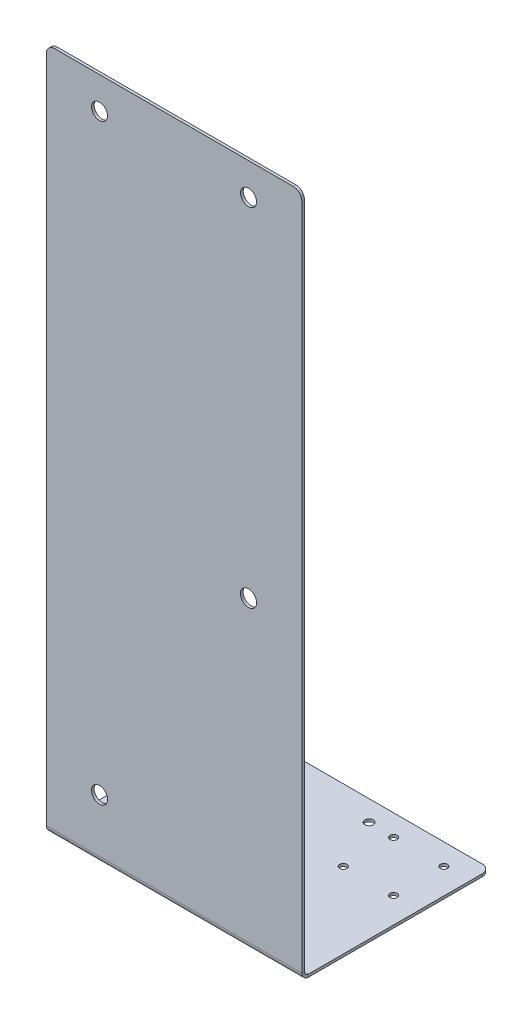
ISO-10303-21;
HEADER;
FILE_DESCRIPTION(('STEP AP214'),'2;1');
FILE_NAME('part.step','',(''),(''),'','','');
FILE_SCHEMA(('AUTOMOTIVE_DESIGN { 1 0 10303 214 1 1 1 1 }'));
ENDSEC;
DATA;
#1=APPLICATION_CONTEXT('core data for automotive mechanical design processes');
#2=APPLICATION_PROTOCOL_DEFINITION('international standard','automotive_design',2000,#1);
#3=PRODUCT_CONTEXT('',#1,'mechanical');
#4=PRODUCT('Part','Part','',(#3));
#5=PRODUCT_RELATED_PRODUCT_CATEGORY('part','',(#4));
#6=PRODUCT_DEFINITION_FORMATION('','',#4);
#7=PRODUCT_DEFINITION_CONTEXT('part definition',#1,'design');
#8=PRODUCT_DEFINITION('design','',#6,#7);
#9=PRODUCT_DEFINITION_SHAPE('','',#8);
#10=(LENGTH_UNIT() NAMED_UNIT(*) SI_UNIT(.MILLI.,.METRE.));
#11=(NAMED_UNIT(*) PLANE_ANGLE_UNIT() SI_UNIT($,.RADIAN.));
#12=(NAMED_UNIT(*) SI_UNIT($,.STERADIAN.) SOLID_ANGLE_UNIT());
#13=UNCERTAINTY_MEASURE_WITH_UNIT(LENGTH_MEASURE(1.E-05),#10,'distance_accuracy_value','');
#14=(GEOMETRIC_REPRESENTATION_CONTEXT(3) GLOBAL_UNCERTAINTY_ASSIGNED_CONTEXT((#13)) GLOBAL_UNIT_ASSIGNED_CONTEXT((#10,
#11,#12)) REPRESENTATION_CONTEXT('',''));
#15=CARTESIAN_POINT('',(0.,0.,0.));
#16=DIRECTION('',(0.,0.,1.));
#17=DIRECTION('',(1.,0.,0.));
#18=AXIS2_PLACEMENT_3D('',#15,#16,#17);
#19=CARTESIAN_POINT('',(71.12,3.175,-52.07));
#20=DIRECTION('',(0.,1.,0.));
#21=DIRECTION('',(0.,0.,1.));
#22=AXIS2_PLACEMENT_3D('',#19,#20,#21);
#23=CYLINDRICAL_SURFACE('',#22,5.08);
#24=DIRECTION('',(0.,1.,0.));
#25=VECTOR('',#24,1.);
#26=CARTESIAN_POINT('',(76.2,3.175,-52.07));
#27=LINE('',#26,#25);
#28=CARTESIAN_POINT('',(76.2,1.5875,-52.07));
#29=VERTEX_POINT('',#28);
#30=CARTESIAN_POINT('',(76.2,3.175,-52.07));
#31=VERTEX_POINT('',#30);
#32=EDGE_CURVE('E11',#29,#31,#27,.T.);
#33=ORIENTED_EDGE('',*,*,#32,.F.);
#34=CARTESIAN_POINT('',(71.12,1.5875,-52.07));
#35=DIRECTION('',(0.,1.,0.));
#36=DIRECTION('',(0.,0.,1.));
#37=AXIS2_PLACEMENT_3D('',#34,#35,#36);
#38=CIRCLE('',#37,5.08);
#39=CARTESIAN_POINT('',(71.12,1.5875,-57.15));
#40=VERTEX_POINT('',#39);
#41=EDGE_CURVE('E134',#29,#40,#38,.T.);
#42=ORIENTED_EDGE('',*,*,#41,.T.);
#43=DIRECTION('',(0.,1.,0.));
#44=VECTOR('',#43,1.);
#45=CARTESIAN_POINT('',(71.12,3.175,-57.15));
#46=LINE('',#45,#44);
#47=CARTESIAN_POINT('',(71.12,3.175,-57.15));
#48=VERTEX_POINT('',#47);
#49=EDGE_CURVE('E48',#40,#48,#46,.T.);
#50=ORIENTED_EDGE('',*,*,#49,.T.);
#51=CARTESIAN_POINT('',(71.12,3.175,-52.07));
#52=DIRECTION('',(0.,1.,0.));
#53=DIRECTION('',(0.,0.,1.));
#54=AXIS2_PLACEMENT_3D('',#51,#52,#53);
#55=CIRCLE('',#54,5.08);
#56=EDGE_CURVE('E221',#31,#48,#55,.T.);
#57=ORIENTED_EDGE('',*,*,#56,.F.);
#58=EDGE_LOOP('',(#33,#42,#50,#57));
#59=FACE_BOUND('',#58,.T.);
#60=ADVANCED_FACE('F38',(#59),#23,.T.);
#61=CARTESIAN_POINT('',(76.2,3.175,-57.15));
#62=DIRECTION('',(0.,0.,-1.));
#63=DIRECTION('',(-1.,0.,0.));
#64=AXIS2_PLACEMENT_3D('',#61,#62,#63);
#65=PLANE('',#64);
#66=ORIENTED_EDGE('',*,*,#49,.F.);
#67=DIRECTION('',(1.,0.,0.));
#68=VECTOR('',#67,1.);
#69=CARTESIAN_POINT('',(0.,1.5875,-57.15));
#70=LINE('',#69,#68);
#71=CARTESIAN_POINT('',(-71.12,1.5875,-57.15));
#72=VERTEX_POINT('',#71);
#73=EDGE_CURVE('E162',#40,#72,#70,.F.);
#74=ORIENTED_EDGE('',*,*,#73,.T.);
#75=DIRECTION('',(0.,1.,0.));
#76=VECTOR('',#75,1.);
#77=CARTESIAN_POINT('',(-71.12,3.175,-57.15));
#78=LINE('',#77,#76);
#79=CARTESIAN_POINT('',(-71.12,3.175,-57.15));
#80=VERTEX_POINT('',#79);
#81=EDGE_CURVE('E214',#72,#80,#78,.T.);
#82=ORIENTED_EDGE('',*,*,#81,.T.);
#83=DIRECTION('',(-1.,0.,0.));
#84=VECTOR('',#83,1.);
#85=CARTESIAN_POINT('',(76.2,3.175,-57.15));
#86=LINE('',#85,#84);
#87=EDGE_CURVE('E230',#48,#80,#86,.T.);
#88=ORIENTED_EDGE('',*,*,#87,.F.);
#89=EDGE_LOOP('',(#66,#74,#82,#88));
#90=FACE_BOUND('',#89,.T.);
#91=ADVANCED_FACE('F234',(#90),#65,.T.);
#92=CARTESIAN_POINT('',(-71.12,3.175,-52.07));
#93=DIRECTION('',(0.,1.,0.));
#94=DIRECTION('',(0.,0.,1.));
#95=AXIS2_PLACEMENT_3D('',#92,#93,#94);
#96=CYLINDRICAL_SURFACE('',#95,5.08);
#97=ORIENTED_EDGE('',*,*,#81,.F.);
#98=CARTESIAN_POINT('',(-71.12,1.5875,-52.07));
#99=DIRECTION('',(0.,1.,0.));
#100=DIRECTION('',(0.,0.,1.));
#101=AXIS2_PLACEMENT_3D('',#98,#99,#100);
#102=CIRCLE('',#101,5.08);
#103=CARTESIAN_POINT('',(-76.2,1.5875,-52.07));
#104=VERTEX_POINT('',#103);
#105=EDGE_CURVE('E159',#72,#104,#102,.T.);
#106=ORIENTED_EDGE('',*,*,#105,.T.);
#107=DIRECTION('',(0.,1.,0.));
#108=VECTOR('',#107,1.);
#109=CARTESIAN_POINT('',(-76.2,3.175,-52.07));
#110=LINE('',#109,#108);
#111=CARTESIAN_POINT('',(-76.2,3.175,-52.07));
#112=VERTEX_POINT('',#111);
#113=EDGE_CURVE('E211',#104,#112,#110,.T.);
#114=ORIENTED_EDGE('',*,*,#113,.T.);
#115=CARTESIAN_POINT('',(-71.12,3.175,-52.07));
#116=DIRECTION('',(0.,1.,0.));
#117=DIRECTION('',(0.,0.,1.));
#118=AXIS2_PLACEMENT_3D('',#115,#116,#117);
#119=CIRCLE('',#118,5.08);
#120=EDGE_CURVE('E235',#80,#112,#119,.T.);
#121=ORIENTED_EDGE('',*,*,#120,.F.);
#122=EDGE_LOOP('',(#97,#106,#114,#121));
#123=FACE_BOUND('',#122,.T.);
#124=ADVANCED_FACE('F323',(#123),#96,.T.);
#125=CARTESIAN_POINT('',(-76.2,3.175,57.15));
#126=DIRECTION('',(-1.,0.,0.));
#127=DIRECTION('',(0.,0.,1.));
#128=AXIS2_PLACEMENT_3D('',#125,#126,#127);
#129=PLANE('',#128);
#130=ORIENTED_EDGE('',*,*,#113,.F.);
#131=DIRECTION('',(0.,0.,1.));
#132=VECTOR('',#131,1.);
#133=CARTESIAN_POINT('',(-76.2,1.5875,0.));
#134=LINE('',#133,#132);
#135=CARTESIAN_POINT('',(-76.2,1.5875,51.435));
#136=VERTEX_POINT('',#135);
#137=EDGE_CURVE('E130',#104,#136,#134,.T.);
#138=ORIENTED_EDGE('',*,*,#137,.T.);
#139=DIRECTION('',(0.,1.,0.));
#140=VECTOR('',#139,1.);
#141=CARTESIAN_POINT('',(-76.2,3.175,51.435));
#142=LINE('',#141,#140);
#143=CARTESIAN_POINT('',(-76.2,3.175,51.435));
#144=VERTEX_POINT('',#143);
#145=EDGE_CURVE('E208',#136,#144,#142,.T.);
#146=ORIENTED_EDGE('',*,*,#145,.T.);
#147=DIRECTION('',(0.,0.,1.));
#148=VECTOR('',#147,1.);
#149=CARTESIAN_POINT('',(-76.2,3.175,57.15));
#150=LINE('',#149,#148);
#151=EDGE_CURVE('E238',#112,#144,#150,.T.);
#152=ORIENTED_EDGE('',*,*,#151,.F.);
#153=EDGE_LOOP('',(#130,#138,#146,#152));
#154=FACE_BOUND('',#153,.T.);
#155=ADVANCED_FACE('F599',(#154),#129,.T.);
#156=CARTESIAN_POINT('',(-76.2,5.71500000000003,51.435));
#157=DIRECTION('',(-1.,0.,0.));
#158=DIRECTION('',(0.,0.,1.));
#159=AXIS2_PLACEMENT_3D('',#156,#157,#158);
#160=PLANE('',#159);
#161=ORIENTED_EDGE('',*,*,#145,.F.);
#162=CARTESIAN_POINT('',(-76.2,5.71500000000003,51.435));
#163=DIRECTION('',(-1.,0.,0.));
#164=DIRECTION('',(0.,0.,1.));
#165=AXIS2_PLACEMENT_3D('',#162,#163,#164);
#166=CIRCLE('',#165,4.1275);
#167=CARTESIAN_POINT('',(-76.2,5.71500000000003,55.5625));
#168=VERTEX_POINT('',#167);
#169=EDGE_CURVE('E126',#168,#136,#166,.F.);
#170=ORIENTED_EDGE('',*,*,#169,.F.);
#171=DIRECTION('',(0.,0.,-1.));
#172=VECTOR('',#171,1.);
#173=CARTESIAN_POINT('',(-76.2,5.71500000000003,53.975));
#174=LINE('',#173,#172);
#175=CARTESIAN_POINT('',(-76.2,5.71500000000003,53.975));
#176=VERTEX_POINT('',#175);
#177=EDGE_CURVE('E56',#168,#176,#174,.T.);
#178=ORIENTED_EDGE('',*,*,#177,.T.);
#179=CARTESIAN_POINT('',(-76.2,5.71500000000003,51.435));
#180=DIRECTION('',(1.,0.,0.));
#181=DIRECTION('',(0.,0.,-1.));
#182=AXIS2_PLACEMENT_3D('',#179,#180,#181);
#183=CIRCLE('',#182,2.54);
#184=EDGE_CURVE('E116',#176,#144,#183,.T.);
#185=ORIENTED_EDGE('',*,*,#184,.T.);
#186=EDGE_LOOP('',(#161,#170,#178,#185));
#187=FACE_BOUND('',#186,.T.);
#188=ADVANCED_FACE('F271',(#187),#160,.T.);
#189=CARTESIAN_POINT('',(-76.2,409.575,53.975));
#190=DIRECTION('',(-1.,0.,0.));
#191=DIRECTION('',(0.,-1.,0.));
#192=AXIS2_PLACEMENT_3D('',#189,#190,#191);
#193=PLANE('',#192);
#194=ORIENTED_EDGE('',*,*,#177,.F.);
#195=DIRECTION('',(0.,1.,0.));
#196=VECTOR('',#195,1.);
#197=CARTESIAN_POINT('',(-76.2,409.575,55.5625));
#198=LINE('',#197,#196);
#199=CARTESIAN_POINT('',(-76.2,404.495,55.5625));
#200=VERTEX_POINT('',#199);
#201=EDGE_CURVE('E155',#200,#168,#198,.F.);
#202=ORIENTED_EDGE('',*,*,#201,.F.);
#203=DIRECTION('',(0.,0.,-1.));
#204=VECTOR('',#203,1.);
#205=CARTESIAN_POINT('',(-76.2,404.495,53.975));
#206=LINE('',#205,#204);
#207=CARTESIAN_POINT('',(-76.2,404.495,53.975));
#208=VERTEX_POINT('',#207);
#209=EDGE_CURVE('E204',#200,#208,#206,.T.);
#210=ORIENTED_EDGE('',*,*,#209,.T.);
#211=DIRECTION('',(0.,-1.,0.));
#212=VECTOR('',#211,1.);
#213=CARTESIAN_POINT('',(-76.2,409.575,53.975));
#214=LINE('',#213,#212);
#215=EDGE_CURVE('E232',#208,#176,#214,.T.);
#216=ORIENTED_EDGE('',*,*,#215,.T.);
#217=EDGE_LOOP('',(#194,#202,#210,#216));
#218=FACE_BOUND('',#217,.T.);
#219=ADVANCED_FACE('F304',(#218),#193,.T.);
#220=CARTESIAN_POINT('',(-71.12,404.495,53.975));
#221=DIRECTION('',(0.,0.,1.));
#222=DIRECTION('',(1.,0.,0.));
#223=AXIS2_PLACEMENT_3D('',#220,#221,#222);
#224=CYLINDRICAL_SURFACE('',#223,5.08);
#225=ORIENTED_EDGE('',*,*,#209,.F.);
#226=CARTESIAN_POINT('',(-71.12,404.495,55.5625));
#227=DIRECTION('',(0.,0.,1.));
#228=DIRECTION('',(1.,0.,0.));
#229=AXIS2_PLACEMENT_3D('',#226,#227,#228);
#230=CIRCLE('',#229,5.08);
#231=CARTESIAN_POINT('',(-71.12,409.575,55.5625));
#232=VERTEX_POINT('',#231);
#233=EDGE_CURVE('E152',#200,#232,#230,.F.);
#234=ORIENTED_EDGE('',*,*,#233,.T.);
#235=DIRECTION('',(0.,0.,-1.));
#236=VECTOR('',#235,1.);
#237=CARTESIAN_POINT('',(-71.12,409.575,53.975));
#238=LINE('',#237,#236);
#239=CARTESIAN_POINT('',(-71.12,409.575,53.975));
#240=VERTEX_POINT('',#239);
#241=EDGE_CURVE('E201',#232,#240,#238,.T.);
#242=ORIENTED_EDGE('',*,*,#241,.T.);
#243=CARTESIAN_POINT('',(-71.12,404.495,53.975));
#244=DIRECTION('',(0.,0.,1.));
#245=DIRECTION('',(1.,0.,0.));
#246=AXIS2_PLACEMENT_3D('',#243,#244,#245);
#247=CIRCLE('',#246,5.08);
#248=EDGE_CURVE('E251',#208,#240,#247,.F.);
#249=ORIENTED_EDGE('',*,*,#248,.F.);
#250=EDGE_LOOP('',(#225,#234,#242,#249));
#251=FACE_BOUND('',#250,.T.);
#252=ADVANCED_FACE('F307',(#251),#224,.T.);
#253=CARTESIAN_POINT('',(-76.2,409.575,53.975));
#254=DIRECTION('',(0.,1.,0.));
#255=DIRECTION('',(-1.,0.,0.));
#256=AXIS2_PLACEMENT_3D('',#253,#254,#255);
#257=PLANE('',#256);
#258=ORIENTED_EDGE('',*,*,#241,.F.);
#259=DIRECTION('',(1.,0.,0.));
#260=VECTOR('',#259,1.);
#261=CARTESIAN_POINT('',(-76.2,409.575,55.5625));
#262=LINE('',#261,#260);
#263=CARTESIAN_POINT('',(71.1199999999999,409.575,55.5625));
#264=VERTEX_POINT('',#263);
#265=EDGE_CURVE('E149',#264,#232,#262,.F.);
#266=ORIENTED_EDGE('',*,*,#265,.F.);
#267=DIRECTION('',(0.,0.,-1.));
#268=VECTOR('',#267,1.);
#269=CARTESIAN_POINT('',(71.1199999999999,409.575,53.975));
#270=LINE('',#269,#268);
#271=CARTESIAN_POINT('',(71.1199999999999,409.575,53.975));
#272=VERTEX_POINT('',#271);
#273=EDGE_CURVE('E198',#264,#272,#270,.T.);
#274=ORIENTED_EDGE('',*,*,#273,.T.);
#275=DIRECTION('',(-1.,0.,0.));
#276=VECTOR('',#275,1.);
#277=CARTESIAN_POINT('',(-76.2,409.575,53.975));
#278=LINE('',#277,#276);
#279=EDGE_CURVE('E254',#272,#240,#278,.T.);
#280=ORIENTED_EDGE('',*,*,#279,.T.);
#281=EDGE_LOOP('',(#258,#266,#274,#280));
#282=FACE_BOUND('',#281,.T.);
#283=ADVANCED_FACE('F309',(#282),#257,.T.);
#284=CARTESIAN_POINT('',(71.12,404.495,53.975));
#285=DIRECTION('',(0.,0.,1.));
#286=DIRECTION('',(1.,0.,0.));
#287=AXIS2_PLACEMENT_3D('',#284,#285,#286);
#288=CYLINDRICAL_SURFACE('',#287,5.08);
#289=ORIENTED_EDGE('',*,*,#273,.F.);
#290=CARTESIAN_POINT('',(71.12,404.495,55.5625));
#291=DIRECTION('',(0.,0.,1.));
#292=DIRECTION('',(1.,0.,0.));
#293=AXIS2_PLACEMENT_3D('',#290,#291,#292);
#294=CIRCLE('',#293,5.08);
#295=CARTESIAN_POINT('',(76.2,404.495,55.5625));
#296=VERTEX_POINT('',#295);
#297=EDGE_CURVE('E146',#264,#296,#294,.F.);
#298=ORIENTED_EDGE('',*,*,#297,.T.);
#299=DIRECTION('',(0.,0.,-1.));
#300=VECTOR('',#299,1.);
#301=CARTESIAN_POINT('',(76.2,404.495,53.975));
#302=LINE('',#301,#300);
#303=CARTESIAN_POINT('',(76.2,404.495,53.975));
#304=VERTEX_POINT('',#303);
#305=EDGE_CURVE('E195',#296,#304,#302,.T.);
#306=ORIENTED_EDGE('',*,*,#305,.T.);
#307=CARTESIAN_POINT('',(71.12,404.495,53.975));
#308=DIRECTION('',(0.,0.,1.));
#309=DIRECTION('',(1.,0.,0.));
#310=AXIS2_PLACEMENT_3D('',#307,#308,#309);
#311=CIRCLE('',#310,5.08);
#312=EDGE_CURVE('E257',#272,#304,#311,.F.);
#313=ORIENTED_EDGE('',*,*,#312,.F.);
#314=EDGE_LOOP('',(#289,#298,#306,#313));
#315=FACE_BOUND('',#314,.T.);
#316=ADVANCED_FACE('F288',(#315),#288,.T.);
#317=CARTESIAN_POINT('',(76.2,409.575,53.975));
#318=DIRECTION('',(-1.,0.,0.));
#319=DIRECTION('',(0.,-1.,0.));
#320=AXIS2_PLACEMENT_3D('',#317,#318,#319);
#321=PLANE('',#320);
#322=ORIENTED_EDGE('',*,*,#305,.F.);
#323=DIRECTION('',(0.,1.,0.));
#324=VECTOR('',#323,1.);
#325=CARTESIAN_POINT('',(76.2,409.575,55.5625));
#326=LINE('',#325,#324);
#327=CARTESIAN_POINT('',(76.2,5.71500000000003,55.5625));
#328=VERTEX_POINT('',#327);
#329=EDGE_CURVE('E142',#296,#328,#326,.F.);
#330=ORIENTED_EDGE('',*,*,#329,.T.);
#331=DIRECTION('',(0.,0.,-1.));
#332=VECTOR('',#331,1.);
#333=CARTESIAN_POINT('',(76.2,5.71500000000003,53.975));
#334=LINE('',#333,#332);
#335=CARTESIAN_POINT('',(76.2,5.71500000000003,53.975));
#336=VERTEX_POINT('',#335);
#337=EDGE_CURVE('E115',#328,#336,#334,.T.);
#338=ORIENTED_EDGE('',*,*,#337,.T.);
#339=DIRECTION('',(0.,-1.,0.));
#340=VECTOR('',#339,1.);
#341=CARTESIAN_POINT('',(76.2,409.575,53.975));
#342=LINE('',#341,#340);
#343=EDGE_CURVE('E260',#304,#336,#342,.T.);
#344=ORIENTED_EDGE('',*,*,#343,.F.);
#345=EDGE_LOOP('',(#322,#330,#338,#344));
#346=FACE_BOUND('',#345,.T.);
#347=ADVANCED_FACE('F297',(#346),#321,.F.);
#348=CARTESIAN_POINT('',(76.2,5.71500000000003,51.435));
#349=DIRECTION('',(1.,0.,0.));
#350=DIRECTION('',(0.,0.,-1.));
#351=AXIS2_PLACEMENT_3D('',#348,#349,#350);
#352=PLANE('',#351);
#353=ORIENTED_EDGE('',*,*,#337,.F.);
#354=CARTESIAN_POINT('',(76.2,5.71500000000003,51.435));
#355=DIRECTION('',(-1.,0.,0.));
#356=DIRECTION('',(0.,0.,1.));
#357=AXIS2_PLACEMENT_3D('',#354,#355,#356);
#358=CIRCLE('',#357,4.1275);
#359=CARTESIAN_POINT('',(76.2,1.5875,51.435));
#360=VERTEX_POINT('',#359);
#361=EDGE_CURVE('E124',#360,#328,#358,.T.);
#362=ORIENTED_EDGE('',*,*,#361,.F.);
#363=DIRECTION('',(0.,1.,0.));
#364=VECTOR('',#363,1.);
#365=CARTESIAN_POINT('',(76.2,3.175,51.435));
#366=LINE('',#365,#364);
#367=CARTESIAN_POINT('',(76.2,3.175,51.435));
#368=VERTEX_POINT('',#367);
#369=EDGE_CURVE('E42',#360,#368,#366,.T.);
#370=ORIENTED_EDGE('',*,*,#369,.T.);
#371=CARTESIAN_POINT('',(76.2,5.71500000000003,51.435));
#372=DIRECTION('',(-1.,0.,0.));
#373=DIRECTION('',(0.,0.,1.));
#374=AXIS2_PLACEMENT_3D('',#371,#372,#373);
#375=CIRCLE('',#374,2.54);
#376=EDGE_CURVE('E266',#368,#336,#375,.T.);
#377=ORIENTED_EDGE('',*,*,#376,.T.);
#378=EDGE_LOOP('',(#353,#362,#370,#377));
#379=FACE_BOUND('',#378,.T.);
#380=ADVANCED_FACE('F136',(#379),#352,.T.);
#381=CARTESIAN_POINT('',(30.9880000000026,3.17500000000537,-44.45));
#382=DIRECTION('',(0.,1.,0.));
#383=DIRECTION('',(0.,0.,1.));
#384=AXIS2_PLACEMENT_3D('',#381,#382,#383);
#385=CYLINDRICAL_SURFACE('',#384,2.159);
#386=CARTESIAN_POINT('',(30.9880000000026,3.17500000000537,-44.45));
#387=DIRECTION('',(0.,1.,0.));
#388=DIRECTION('',(0.,0.,1.));
#389=AXIS2_PLACEMENT_3D('',#386,#387,#388);
#390=CIRCLE('',#389,2.159);
#391=CARTESIAN_POINT('',(30.9880000000026,3.17500000000537,-42.291));
#392=VERTEX_POINT('',#391);
#393=EDGE_CURVE('E140',#392,#392,#390,.T.);
#394=ORIENTED_EDGE('',*,*,#393,.T.);
#395=EDGE_LOOP('',(#394));
#396=FACE_BOUND('',#395,.T.);
#397=CARTESIAN_POINT('',(30.9880000000026,1.58750000000537,-44.45));
#398=DIRECTION('',(0.,1.,0.));
#399=DIRECTION('',(0.,0.,1.));
#400=AXIS2_PLACEMENT_3D('',#397,#398,#399);
#401=CIRCLE('',#400,2.159);
#402=CARTESIAN_POINT('',(30.9880000000026,1.58750000000537,-42.291));
#403=VERTEX_POINT('',#402);
#404=EDGE_CURVE('E167',#403,#403,#401,.T.);
#405=ORIENTED_EDGE('',*,*,#404,.F.);
#406=EDGE_LOOP('',(#405));
#407=FACE_BOUND('',#406,.T.);
#408=ADVANCED_FACE('F329',(#396,#407),#385,.F.);
#409=CARTESIAN_POINT('',(15.8749999999996,3.17500000000137,37.465));
#410=DIRECTION('',(0.,1.,0.));
#411=DIRECTION('',(0.,0.,1.));
#412=AXIS2_PLACEMENT_3D('',#409,#410,#411);
#413=CYLINDRICAL_SURFACE('',#412,2.54);
#414=CARTESIAN_POINT('',(15.8749999999996,3.17500000000137,37.465));
#415=DIRECTION('',(0.,1.,0.));
#416=DIRECTION('',(0.,0.,1.));
#417=AXIS2_PLACEMENT_3D('',#414,#415,#416);
#418=CIRCLE('',#417,2.54);
#419=CARTESIAN_POINT('',(15.8749999999996,3.17500000000137,40.005));
#420=VERTEX_POINT('',#419);
#421=EDGE_CURVE('E672',#420,#420,#418,.T.);
#422=ORIENTED_EDGE('',*,*,#421,.T.);
#423=EDGE_LOOP('',(#422));
#424=FACE_BOUND('',#423,.T.);
#425=CARTESIAN_POINT('',(15.8749999999996,1.58750000000137,37.465));
#426=DIRECTION('',(0.,1.,0.));
#427=DIRECTION('',(0.,0.,1.));
#428=AXIS2_PLACEMENT_3D('',#425,#426,#427);
#429=CIRCLE('',#428,2.54);
#430=CARTESIAN_POINT('',(15.8749999999996,1.58750000000137,40.005));
#431=VERTEX_POINT('',#430);
#432=EDGE_CURVE('E170',#431,#431,#429,.T.);
#433=ORIENTED_EDGE('',*,*,#432,.F.);
#434=EDGE_LOOP('',(#433));
#435=FACE_BOUND('',#434,.T.);
#436=ADVANCED_FACE('F332',(#424,#435),#413,.F.);
#437=CARTESIAN_POINT('',(-66.6750000000018,3.17500000000914,37.465));
#438=DIRECTION('',(0.,1.,0.));
#439=DIRECTION('',(0.,0.,1.));
#440=AXIS2_PLACEMENT_3D('',#437,#438,#439);
#441=CYLINDRICAL_SURFACE('',#440,2.54000000000001);
#442=CARTESIAN_POINT('',(-66.6750000000018,3.17500000000914,37.465));
#443=DIRECTION('',(0.,1.,0.));
#444=DIRECTION('',(0.,0.,1.));
#445=AXIS2_PLACEMENT_3D('',#442,#443,#444);
#446=CIRCLE('',#445,2.54000000000001);
#447=CARTESIAN_POINT('',(-66.6750000000018,3.17500000000914,40.005));
#448=VERTEX_POINT('',#447);
#449=EDGE_CURVE('E676',#448,#448,#446,.T.);
#450=ORIENTED_EDGE('',*,*,#449,.T.);
#451=EDGE_LOOP('',(#450));
#452=FACE_BOUND('',#451,.T.);
#453=CARTESIAN_POINT('',(-66.6750000000018,1.58750000000914,37.465));
#454=DIRECTION('',(0.,1.,0.));
#455=DIRECTION('',(0.,0.,1.));
#456=AXIS2_PLACEMENT_3D('',#453,#454,#455);
#457=CIRCLE('',#456,2.54000000000001);
#458=CARTESIAN_POINT('',(-66.6750000000018,1.58750000000914,40.005));
#459=VERTEX_POINT('',#458);
#460=EDGE_CURVE('E174',#459,#459,#457,.T.);
#461=ORIENTED_EDGE('',*,*,#460,.F.);
#462=EDGE_LOOP('',(#461));
#463=FACE_BOUND('',#462,.T.);
#464=ADVANCED_FACE('F336',(#452,#463),#441,.F.);
#465=CARTESIAN_POINT('',(15.8749999999995,3.17500000000387,-44.958));
#466=DIRECTION('',(0.,1.,0.));
#467=DIRECTION('',(0.,0.,1.));
#468=AXIS2_PLACEMENT_3D('',#465,#466,#467);
#469=CYLINDRICAL_SURFACE('',#468,2.54);
#470=CARTESIAN_POINT('',(15.8749999999995,3.17500000000387,-44.958));
#471=DIRECTION('',(0.,1.,0.));
#472=DIRECTION('',(0.,0.,1.));
#473=AXIS2_PLACEMENT_3D('',#470,#471,#472);
#474=CIRCLE('',#473,2.54);
#475=CARTESIAN_POINT('',(15.8749999999995,3.17500000000387,-42.418));
#476=VERTEX_POINT('',#475);
#477=EDGE_CURVE('E680',#476,#476,#474,.T.);
#478=ORIENTED_EDGE('',*,*,#477,.T.);
#479=EDGE_LOOP('',(#478));
#480=FACE_BOUND('',#479,.T.);
#481=CARTESIAN_POINT('',(15.8749999999995,1.58750000000387,-44.958));
#482=DIRECTION('',(0.,1.,0.));
#483=DIRECTION('',(0.,0.,1.));
#484=AXIS2_PLACEMENT_3D('',#481,#482,#483);
#485=CIRCLE('',#484,2.54);
#486=CARTESIAN_POINT('',(15.8749999999995,1.58750000000387,-42.418));
#487=VERTEX_POINT('',#486);
#488=EDGE_CURVE('E177',#487,#487,#485,.T.);
#489=ORIENTED_EDGE('',*,*,#488,.F.);
#490=EDGE_LOOP('',(#489));
#491=FACE_BOUND('',#490,.T.);
#492=ADVANCED_FACE('F340',(#480,#491),#469,.F.);
#493=CARTESIAN_POINT('',(60.9386025101175,3.17500000000739,-44.4600000000001));
#494=DIRECTION('',(0.,1.,0.));
#495=DIRECTION('',(0.,0.,1.));
#496=AXIS2_PLACEMENT_3D('',#493,#494,#495);
#497=CYLINDRICAL_SURFACE('',#496,2.14999999999998);
#498=CARTESIAN_POINT('',(60.9386025101175,3.17500000000739,-44.4600000000001));
#499=DIRECTION('',(0.,1.,0.));
#500=DIRECTION('',(0.,0.,1.));
#501=AXIS2_PLACEMENT_3D('',#498,#499,#500);
#502=CIRCLE('',#501,2.14999999999998);
#503=CARTESIAN_POINT('',(60.9386025101175,3.17500000000739,-42.3100000000001));
#504=VERTEX_POINT('',#503);
#505=EDGE_CURVE('E684',#504,#504,#502,.T.);
#506=ORIENTED_EDGE('',*,*,#505,.T.);
#507=EDGE_LOOP('',(#506));
#508=FACE_BOUND('',#507,.T.);
#509=CARTESIAN_POINT('',(60.9386025101175,1.58750000000739,-44.4600000000001));
#510=DIRECTION('',(0.,1.,0.));
#511=DIRECTION('',(0.,0.,1.));
#512=AXIS2_PLACEMENT_3D('',#509,#510,#511);
#513=CIRCLE('',#512,2.14999999999998);
#514=CARTESIAN_POINT('',(60.9386025101175,1.58750000000739,-42.3100000000001));
#515=VERTEX_POINT('',#514);
#516=EDGE_CURVE('E180',#515,#515,#513,.T.);
#517=ORIENTED_EDGE('',*,*,#516,.F.);
#518=EDGE_LOOP('',(#517));
#519=FACE_BOUND('',#518,.T.);
#520=ADVANCED_FACE('F344',(#508,#519),#497,.F.);
#521=CARTESIAN_POINT('',(60.9600000000001,3.17500000000201,-14.4780000000097));
#522=DIRECTION('',(0.,1.,0.));
#523=DIRECTION('',(0.,0.,1.));
#524=AXIS2_PLACEMENT_3D('',#521,#522,#523);
#525=CYLINDRICAL_SURFACE('',#524,2.15899999999999);
#526=CARTESIAN_POINT('',(60.9600000000001,3.17500000000201,-14.4780000000097));
#527=DIRECTION('',(0.,1.,0.));
#528=DIRECTION('',(0.,0.,1.));
#529=AXIS2_PLACEMENT_3D('',#526,#527,#528);
#530=CIRCLE('',#529,2.15899999999999);
#531=CARTESIAN_POINT('',(60.9600000000001,3.17500000000201,-12.3190000000097));
#532=VERTEX_POINT('',#531);
#533=EDGE_CURVE('E688',#532,#532,#530,.T.);
#534=ORIENTED_EDGE('',*,*,#533,.T.);
#535=EDGE_LOOP('',(#534));
#536=FACE_BOUND('',#535,.T.);
#537=CARTESIAN_POINT('',(60.9600000000001,1.58750000000201,-14.4780000000097));
#538=DIRECTION('',(0.,1.,0.));
#539=DIRECTION('',(0.,0.,1.));
#540=AXIS2_PLACEMENT_3D('',#537,#538,#539);
#541=CIRCLE('',#540,2.15899999999999);
#542=CARTESIAN_POINT('',(60.9600000000001,1.58750000000201,-12.3190000000097));
#543=VERTEX_POINT('',#542);
#544=EDGE_CURVE('E183',#543,#543,#541,.T.);
#545=ORIENTED_EDGE('',*,*,#544,.F.);
#546=EDGE_LOOP('',(#545));
#547=FACE_BOUND('',#546,.T.);
#548=ADVANCED_FACE('F348',(#536,#547),#525,.F.);
#549=CARTESIAN_POINT('',(30.938602510105,3.1750000000029,-14.478));
#550=DIRECTION('',(0.,1.,0.));
#551=DIRECTION('',(0.,0.,1.));
#552=AXIS2_PLACEMENT_3D('',#549,#550,#551);
#553=CYLINDRICAL_SURFACE('',#552,2.159);
#554=CARTESIAN_POINT('',(30.938602510105,3.1750000000029,-14.478));
#555=DIRECTION('',(0.,1.,0.));
#556=DIRECTION('',(0.,0.,1.));
#557=AXIS2_PLACEMENT_3D('',#554,#555,#556);
#558=CIRCLE('',#557,2.159);
#559=CARTESIAN_POINT('',(30.938602510105,3.1750000000029,-12.319));
#560=VERTEX_POINT('',#559);
#561=EDGE_CURVE('E692',#560,#560,#558,.T.);
#562=ORIENTED_EDGE('',*,*,#561,.T.);
#563=EDGE_LOOP('',(#562));
#564=FACE_BOUND('',#563,.T.);
#565=CARTESIAN_POINT('',(30.938602510105,1.5875000000029,-14.478));
#566=DIRECTION('',(0.,1.,0.));
#567=DIRECTION('',(0.,0.,1.));
#568=AXIS2_PLACEMENT_3D('',#565,#566,#567);
#569=CIRCLE('',#568,2.159);
#570=CARTESIAN_POINT('',(30.938602510105,1.5875000000029,-12.319));
#571=VERTEX_POINT('',#570);
#572=EDGE_CURVE('E186',#571,#571,#569,.T.);
#573=ORIENTED_EDGE('',*,*,#572,.F.);
#574=EDGE_LOOP('',(#573));
#575=FACE_BOUND('',#574,.T.);
#576=ADVANCED_FACE('F352',(#564,#575),#553,.F.);
#577=CARTESIAN_POINT('',(-66.6750000000005,3.17500000000326,-45.085));
#578=DIRECTION('',(0.,1.,0.));
#579=DIRECTION('',(0.,0.,1.));
#580=AXIS2_PLACEMENT_3D('',#577,#578,#579);
#581=CYLINDRICAL_SURFACE('',#580,2.53999999999998);
#582=CARTESIAN_POINT('',(-66.6750000000005,3.17500000000326,-45.085));
#583=DIRECTION('',(0.,1.,0.));
#584=DIRECTION('',(0.,0.,1.));
#585=AXIS2_PLACEMENT_3D('',#582,#583,#584);
#586=CIRCLE('',#585,2.53999999999998);
#587=CARTESIAN_POINT('',(-66.6750000000005,3.17500000000326,-42.545));
#588=VERTEX_POINT('',#587);
#589=EDGE_CURVE('E241',#588,#588,#586,.T.);
#590=ORIENTED_EDGE('',*,*,#589,.T.);
#591=EDGE_LOOP('',(#590));
#592=FACE_BOUND('',#591,.T.);
#593=CARTESIAN_POINT('',(-66.6750000000005,1.58750000000326,-45.085));
#594=DIRECTION('',(0.,1.,0.));
#595=DIRECTION('',(0.,0.,1.));
#596=AXIS2_PLACEMENT_3D('',#593,#594,#595);
#597=CIRCLE('',#596,2.53999999999998);
#598=CARTESIAN_POINT('',(-66.6750000000005,1.58750000000326,-42.545));
#599=VERTEX_POINT('',#598);
#600=EDGE_CURVE('E189',#599,#599,#597,.T.);
#601=ORIENTED_EDGE('',*,*,#600,.F.);
#602=EDGE_LOOP('',(#601));
#603=FACE_BOUND('',#602,.T.);
#604=ADVANCED_FACE('F355',(#592,#603),#581,.F.);
#605=CARTESIAN_POINT('',(-25.4,3.17500000000104,-3.80999999999998));
#606=DIRECTION('',(0.,1.,0.));
#607=DIRECTION('',(0.,0.,1.));
#608=AXIS2_PLACEMENT_3D('',#605,#606,#607);
#609=CYLINDRICAL_SURFACE('',#608,30.988);
#610=CARTESIAN_POINT('',(-25.4,3.17500000000104,-3.80999999999998));
#611=DIRECTION('',(0.,1.,0.));
#612=DIRECTION('',(0.,0.,1.));
#613=AXIS2_PLACEMENT_3D('',#610,#611,#612);
#614=CIRCLE('',#613,30.988);
#615=CARTESIAN_POINT('',(-25.4,3.17500000000104,27.178));
#616=VERTEX_POINT('',#615);
#617=EDGE_CURVE('E236',#616,#616,#614,.T.);
#618=ORIENTED_EDGE('',*,*,#617,.T.);
#619=EDGE_LOOP('',(#618));
#620=FACE_BOUND('',#619,.T.);
#621=CARTESIAN_POINT('',(-25.4,1.58750000000104,-3.80999999999998));
#622=DIRECTION('',(0.,1.,0.));
#623=DIRECTION('',(0.,0.,1.));
#624=AXIS2_PLACEMENT_3D('',#621,#622,#623);
#625=CIRCLE('',#624,30.988);
#626=CARTESIAN_POINT('',(-25.4,1.58750000000104,27.178));
#627=VERTEX_POINT('',#626);
#628=EDGE_CURVE('E165',#627,#627,#625,.T.);
#629=ORIENTED_EDGE('',*,*,#628,.F.);
#630=EDGE_LOOP('',(#629));
#631=FACE_BOUND('',#630,.T.);
#632=ADVANCED_FACE('F40',(#620,#631),#609,.F.);
#633=CARTESIAN_POINT('',(76.2,3.175,57.15));
#634=DIRECTION('',(1.,0.,0.));
#635=DIRECTION('',(0.,0.,-1.));
#636=AXIS2_PLACEMENT_3D('',#633,#634,#635);
#637=PLANE('',#636);
#638=DIRECTION('',(0.,0.,1.));
#639=VECTOR('',#638,1.);
#640=CARTESIAN_POINT('',(76.2,1.5875,0.));
#641=LINE('',#640,#639);
#642=EDGE_CURVE('E106',#360,#29,#641,.F.);
#643=ORIENTED_EDGE('',*,*,#642,.T.);
#644=ORIENTED_EDGE('',*,*,#32,.T.);
#645=DIRECTION('',(0.,0.,-1.));
#646=VECTOR('',#645,1.);
#647=CARTESIAN_POINT('',(76.2,3.175,57.15));
#648=LINE('',#647,#646);
#649=EDGE_CURVE('E109',#368,#31,#648,.T.);
#650=ORIENTED_EDGE('',*,*,#649,.F.);
#651=ORIENTED_EDGE('',*,*,#369,.F.);
#652=EDGE_LOOP('',(#643,#644,#650,#651));
#653=FACE_BOUND('',#652,.T.);
#654=ADVANCED_FACE('F104',(#653),#637,.T.);
#655=CARTESIAN_POINT('',(-76.2,5.71500000000003,51.435));
#656=DIRECTION('',(-1.,0.,0.));
#657=DIRECTION('',(0.,0.,1.));
#658=AXIS2_PLACEMENT_3D('',#655,#656,#657);
#659=CYLINDRICAL_SURFACE('',#658,2.54);
#660=ORIENTED_EDGE('',*,*,#376,.F.);
#661=DIRECTION('',(-1.,0.,0.));
#662=VECTOR('',#661,1.);
#663=CARTESIAN_POINT('',(0.,3.175,51.435));
#664=LINE('',#663,#662);
#665=EDGE_CURVE('E247',#144,#368,#664,.F.);
#666=ORIENTED_EDGE('',*,*,#665,.F.);
#667=ORIENTED_EDGE('',*,*,#184,.F.);
#668=DIRECTION('',(-1.,0.,0.));
#669=VECTOR('',#668,1.);
#670=CARTESIAN_POINT('',(-76.2,5.71500000000003,53.975));
#671=LINE('',#670,#669);
#672=EDGE_CURVE('E263',#336,#176,#671,.T.);
#673=ORIENTED_EDGE('',*,*,#672,.F.);
#674=EDGE_LOOP('',(#660,#666,#667,#673));
#675=FACE_BOUND('',#674,.T.);
#676=ADVANCED_FACE('F276',(#675),#659,.F.);
#677=CARTESIAN_POINT('',(-76.2,409.575,53.975));
#678=DIRECTION('',(0.,0.,1.));
#679=DIRECTION('',(1.,0.,0.));
#680=AXIS2_PLACEMENT_3D('',#677,#678,#679);
#681=PLANE('',#680);
#682=CARTESIAN_POINT('',(-44.45,37.465,53.975));
#683=DIRECTION('',(0.,0.,-1.));
#684=DIRECTION('',(-1.,0.,0.));
#685=AXIS2_PLACEMENT_3D('',#682,#683,#684);
#686=CIRCLE('',#685,4.826);
#687=CARTESIAN_POINT('',(-49.276,37.465,53.975));
#688=VERTEX_POINT('',#687);
#689=EDGE_CURVE('E709',#688,#688,#686,.T.);
#690=ORIENTED_EDGE('',*,*,#689,.F.);
#691=EDGE_LOOP('',(#690));
#692=FACE_BOUND('',#691,.T.);
#693=CARTESIAN_POINT('',(44.45,183.515,53.975));
#694=DIRECTION('',(0.,0.,-1.));
#695=DIRECTION('',(-1.,0.,0.));
#696=AXIS2_PLACEMENT_3D('',#693,#694,#695);
#697=CIRCLE('',#696,4.826);
#698=CARTESIAN_POINT('',(39.624,183.515,53.975));
#699=VERTEX_POINT('',#698);
#700=EDGE_CURVE('E715',#699,#699,#697,.T.);
#701=ORIENTED_EDGE('',*,*,#700,.F.);
#702=EDGE_LOOP('',(#701));
#703=FACE_BOUND('',#702,.T.);
#704=CARTESIAN_POINT('',(-44.45,390.525,53.975));
#705=DIRECTION('',(0.,0.,-1.));
#706=DIRECTION('',(-1.,0.,0.));
#707=AXIS2_PLACEMENT_3D('',#704,#705,#706);
#708=CIRCLE('',#707,4.7625);
#709=CARTESIAN_POINT('',(-49.2125,390.525,53.975));
#710=VERTEX_POINT('',#709);
#711=EDGE_CURVE('E721',#710,#710,#708,.T.);
#712=ORIENTED_EDGE('',*,*,#711,.F.);
#713=EDGE_LOOP('',(#712));
#714=FACE_BOUND('',#713,.T.);
#715=CARTESIAN_POINT('',(44.45,390.525,53.975));
#716=DIRECTION('',(0.,0.,-1.));
#717=DIRECTION('',(-1.,0.,0.));
#718=AXIS2_PLACEMENT_3D('',#715,#716,#717);
#719=CIRCLE('',#718,4.7625);
#720=CARTESIAN_POINT('',(39.6875,390.525,53.975));
#721=VERTEX_POINT('',#720);
#722=EDGE_CURVE('E703',#721,#721,#719,.T.);
#723=ORIENTED_EDGE('',*,*,#722,.F.);
#724=EDGE_LOOP('',(#723));
#725=FACE_BOUND('',#724,.T.);
#726=ORIENTED_EDGE('',*,*,#215,.F.);
#727=ORIENTED_EDGE('',*,*,#248,.T.);
#728=ORIENTED_EDGE('',*,*,#279,.F.);
#729=ORIENTED_EDGE('',*,*,#312,.T.);
#730=ORIENTED_EDGE('',*,*,#343,.T.);
#731=ORIENTED_EDGE('',*,*,#672,.T.);
#732=EDGE_LOOP('',(#726,#727,#728,#729,#730,#731));
#733=FACE_BOUND('',#732,.T.);
#734=ADVANCED_FACE('F296',(#692,#703,#714,#725,#733),#681,.F.);
#735=CARTESIAN_POINT('',(0.,3.175,0.));
#736=DIRECTION('',(0.,1.,0.));
#737=DIRECTION('',(0.,0.,1.));
#738=AXIS2_PLACEMENT_3D('',#735,#736,#737);
#739=PLANE('',#738);
#740=ORIENTED_EDGE('',*,*,#393,.F.);
#741=EDGE_LOOP('',(#740));
#742=FACE_BOUND('',#741,.T.);
#743=ORIENTED_EDGE('',*,*,#421,.F.);
#744=EDGE_LOOP('',(#743));
#745=FACE_BOUND('',#744,.T.);
#746=ORIENTED_EDGE('',*,*,#449,.F.);
#747=EDGE_LOOP('',(#746));
#748=FACE_BOUND('',#747,.T.);
#749=ORIENTED_EDGE('',*,*,#477,.F.);
#750=EDGE_LOOP('',(#749));
#751=FACE_BOUND('',#750,.T.);
#752=ORIENTED_EDGE('',*,*,#505,.F.);
#753=EDGE_LOOP('',(#752));
#754=FACE_BOUND('',#753,.T.);
#755=ORIENTED_EDGE('',*,*,#533,.F.);
#756=EDGE_LOOP('',(#755));
#757=FACE_BOUND('',#756,.T.);
#758=ORIENTED_EDGE('',*,*,#561,.F.);
#759=EDGE_LOOP('',(#758));
#760=FACE_BOUND('',#759,.T.);
#761=ORIENTED_EDGE('',*,*,#589,.F.);
#762=EDGE_LOOP('',(#761));
#763=FACE_BOUND('',#762,.T.);
#764=ORIENTED_EDGE('',*,*,#617,.F.);
#765=EDGE_LOOP('',(#764));
#766=FACE_BOUND('',#765,.T.);
#767=ORIENTED_EDGE('',*,*,#87,.T.);
#768=ORIENTED_EDGE('',*,*,#120,.T.);
#769=ORIENTED_EDGE('',*,*,#151,.T.);
#770=ORIENTED_EDGE('',*,*,#665,.T.);
#771=ORIENTED_EDGE('',*,*,#649,.T.);
#772=ORIENTED_EDGE('',*,*,#56,.T.);
#773=EDGE_LOOP('',(#767,#768,#769,#770,#771,#772));
#774=FACE_BOUND('',#773,.T.);
#775=ADVANCED_FACE('F228',(#742,#745,#748,#751,#754,#757,#760,#763,#766,#774),#739,.T.);
#776=CARTESIAN_POINT('',(-76.2,5.71500000000003,51.435));
#777=DIRECTION('',(-1.,0.,0.));
#778=DIRECTION('',(0.,0.,1.));
#779=AXIS2_PLACEMENT_3D('',#776,#777,#778);
#780=CYLINDRICAL_SURFACE('',#779,4.1275);
#781=ORIENTED_EDGE('',*,*,#361,.T.);
#782=DIRECTION('',(1.,0.,0.));
#783=VECTOR('',#782,1.);
#784=CARTESIAN_POINT('',(-76.2,5.71500000000003,55.5625));
#785=LINE('',#784,#783);
#786=EDGE_CURVE('E138',#328,#168,#785,.F.);
#787=ORIENTED_EDGE('',*,*,#786,.T.);
#788=ORIENTED_EDGE('',*,*,#169,.T.);
#789=DIRECTION('',(1.,0.,0.));
#790=VECTOR('',#789,1.);
#791=CARTESIAN_POINT('',(0.,1.5875,51.435));
#792=LINE('',#791,#790);
#793=EDGE_CURVE('E121',#136,#360,#792,.T.);
#794=ORIENTED_EDGE('',*,*,#793,.T.);
#795=EDGE_LOOP('',(#781,#787,#788,#794));
#796=FACE_BOUND('',#795,.T.);
#797=ADVANCED_FACE('F122',(#796),#780,.T.);
#798=CARTESIAN_POINT('',(-76.2,409.575,55.5625));
#799=DIRECTION('',(0.,0.,1.));
#800=DIRECTION('',(1.,0.,0.));
#801=AXIS2_PLACEMENT_3D('',#798,#799,#800);
#802=PLANE('',#801);
#803=CARTESIAN_POINT('',(-44.45,37.465,55.5625));
#804=DIRECTION('',(0.,0.,-1.));
#805=DIRECTION('',(-1.,0.,0.));
#806=AXIS2_PLACEMENT_3D('',#803,#804,#805);
#807=CIRCLE('',#806,4.826);
#808=CARTESIAN_POINT('',(-49.276,37.465,55.5625));
#809=VERTEX_POINT('',#808);
#810=EDGE_CURVE('E712',#809,#809,#807,.T.);
#811=ORIENTED_EDGE('',*,*,#810,.T.);
#812=EDGE_LOOP('',(#811));
#813=FACE_BOUND('',#812,.T.);
#814=CARTESIAN_POINT('',(44.45,183.515,55.5625));
#815=DIRECTION('',(0.,0.,-1.));
#816=DIRECTION('',(-1.,0.,0.));
#817=AXIS2_PLACEMENT_3D('',#814,#815,#816);
#818=CIRCLE('',#817,4.826);
#819=CARTESIAN_POINT('',(39.624,183.515,55.5625));
#820=VERTEX_POINT('',#819);
#821=EDGE_CURVE('E718',#820,#820,#818,.T.);
#822=ORIENTED_EDGE('',*,*,#821,.T.);
#823=EDGE_LOOP('',(#822));
#824=FACE_BOUND('',#823,.T.);
#825=CARTESIAN_POINT('',(-44.45,390.525,55.5625));
#826=DIRECTION('',(0.,0.,-1.));
#827=DIRECTION('',(-1.,0.,0.));
#828=AXIS2_PLACEMENT_3D('',#825,#826,#827);
#829=CIRCLE('',#828,4.7625);
#830=CARTESIAN_POINT('',(-49.2125,390.525,55.5625));
#831=VERTEX_POINT('',#830);
#832=EDGE_CURVE('E706',#831,#831,#829,.T.);
#833=ORIENTED_EDGE('',*,*,#832,.T.);
#834=EDGE_LOOP('',(#833));
#835=FACE_BOUND('',#834,.T.);
#836=CARTESIAN_POINT('',(44.45,390.525,55.5625));
#837=DIRECTION('',(0.,0.,-1.));
#838=DIRECTION('',(-1.,0.,0.));
#839=AXIS2_PLACEMENT_3D('',#836,#837,#838);
#840=CIRCLE('',#839,4.7625);
#841=CARTESIAN_POINT('',(39.6875,390.525,55.5625));
#842=VERTEX_POINT('',#841);
#843=EDGE_CURVE('E171',#842,#842,#840,.T.);
#844=ORIENTED_EDGE('',*,*,#843,.T.);
#845=EDGE_LOOP('',(#844));
#846=FACE_BOUND('',#845,.T.);
#847=ORIENTED_EDGE('',*,*,#201,.T.);
#848=ORIENTED_EDGE('',*,*,#786,.F.);
#849=ORIENTED_EDGE('',*,*,#329,.F.);
#850=ORIENTED_EDGE('',*,*,#297,.F.);
#851=ORIENTED_EDGE('',*,*,#265,.T.);
#852=ORIENTED_EDGE('',*,*,#233,.F.);
#853=EDGE_LOOP('',(#847,#848,#849,#850,#851,#852));
#854=FACE_BOUND('',#853,.T.);
#855=ADVANCED_FACE('F299',(#813,#824,#835,#846,#854),#802,.T.);
#856=CARTESIAN_POINT('',(0.,1.5875,0.));
#857=DIRECTION('',(0.,1.,0.));
#858=DIRECTION('',(0.,0.,1.));
#859=AXIS2_PLACEMENT_3D('',#856,#857,#858);
#860=PLANE('',#859);
#861=ORIENTED_EDGE('',*,*,#404,.T.);
#862=EDGE_LOOP('',(#861));
#863=FACE_BOUND('',#862,.T.);
#864=ORIENTED_EDGE('',*,*,#432,.T.);
#865=EDGE_LOOP('',(#864));
#866=FACE_BOUND('',#865,.T.);
#867=ORIENTED_EDGE('',*,*,#460,.T.);
#868=EDGE_LOOP('',(#867));
#869=FACE_BOUND('',#868,.T.);
#870=ORIENTED_EDGE('',*,*,#488,.T.);
#871=EDGE_LOOP('',(#870));
#872=FACE_BOUND('',#871,.T.);
#873=ORIENTED_EDGE('',*,*,#516,.T.);
#874=EDGE_LOOP('',(#873));
#875=FACE_BOUND('',#874,.T.);
#876=ORIENTED_EDGE('',*,*,#544,.T.);
#877=EDGE_LOOP('',(#876));
#878=FACE_BOUND('',#877,.T.);
#879=ORIENTED_EDGE('',*,*,#572,.T.);
#880=EDGE_LOOP('',(#879));
#881=FACE_BOUND('',#880,.T.);
#882=ORIENTED_EDGE('',*,*,#600,.T.);
#883=EDGE_LOOP('',(#882));
#884=FACE_BOUND('',#883,.T.);
#885=ORIENTED_EDGE('',*,*,#628,.T.);
#886=EDGE_LOOP('',(#885));
#887=FACE_BOUND('',#886,.T.);
#888=ORIENTED_EDGE('',*,*,#73,.F.);
#889=ORIENTED_EDGE('',*,*,#41,.F.);
#890=ORIENTED_EDGE('',*,*,#642,.F.);
#891=ORIENTED_EDGE('',*,*,#793,.F.);
#892=ORIENTED_EDGE('',*,*,#137,.F.);
#893=ORIENTED_EDGE('',*,*,#105,.F.);
#894=EDGE_LOOP('',(#888,#889,#890,#891,#892,#893));
#895=FACE_BOUND('',#894,.T.);
#896=ADVANCED_FACE('F133',(#863,#866,#869,#872,#875,#878,#881,#884,#887,#895),#860,.F.);
#897=CARTESIAN_POINT('',(44.45,390.525,55.5625));
#898=DIRECTION('',(0.,0.,-1.));
#899=DIRECTION('',(-1.,0.,0.));
#900=AXIS2_PLACEMENT_3D('',#897,#898,#899);
#901=CYLINDRICAL_SURFACE('',#900,4.7625);
#902=ORIENTED_EDGE('',*,*,#843,.F.);
#903=EDGE_LOOP('',(#902));
#904=FACE_BOUND('',#903,.T.);
#905=ORIENTED_EDGE('',*,*,#722,.T.);
#906=EDGE_LOOP('',(#905));
#907=FACE_BOUND('',#906,.T.);
#908=ADVANCED_FACE('F370',(#904,#907),#901,.F.);
#909=CARTESIAN_POINT('',(-44.45,390.525,55.5625));
#910=DIRECTION('',(0.,0.,-1.));
#911=DIRECTION('',(-1.,0.,0.));
#912=AXIS2_PLACEMENT_3D('',#909,#910,#911);
#913=CYLINDRICAL_SURFACE('',#912,4.7625);
#914=ORIENTED_EDGE('',*,*,#832,.F.);
#915=EDGE_LOOP('',(#914));
#916=FACE_BOUND('',#915,.T.);
#917=ORIENTED_EDGE('',*,*,#711,.T.);
#918=EDGE_LOOP('',(#917));
#919=FACE_BOUND('',#918,.T.);
#920=ADVANCED_FACE('F379',(#916,#919),#913,.F.);
#921=CARTESIAN_POINT('',(44.45,183.515,55.5625));
#922=DIRECTION('',(0.,0.,-1.));
#923=DIRECTION('',(-1.,0.,0.));
#924=AXIS2_PLACEMENT_3D('',#921,#922,#923);
#925=CYLINDRICAL_SURFACE('',#924,4.826);
#926=ORIENTED_EDGE('',*,*,#821,.F.);
#927=EDGE_LOOP('',(#926));
#928=FACE_BOUND('',#927,.T.);
#929=ORIENTED_EDGE('',*,*,#700,.T.);
#930=EDGE_LOOP('',(#929));
#931=FACE_BOUND('',#930,.T.);
#932=ADVANCED_FACE('F496',(#928,#931),#925,.F.);
#933=CARTESIAN_POINT('',(-44.45,37.465,55.5625));
#934=DIRECTION('',(0.,0.,-1.));
#935=DIRECTION('',(-1.,0.,0.));
#936=AXIS2_PLACEMENT_3D('',#933,#934,#935);
#937=CYLINDRICAL_SURFACE('',#936,4.826);
#938=ORIENTED_EDGE('',*,*,#810,.F.);
#939=EDGE_LOOP('',(#938));
#940=FACE_BOUND('',#939,.T.);
#941=ORIENTED_EDGE('',*,*,#689,.T.);
#942=EDGE_LOOP('',(#941));
#943=FACE_BOUND('',#942,.T.);
#944=ADVANCED_FACE('F507',(#940,#943),#937,.F.);
#945=CLOSED_SHELL('',(#60,#91,#124,#155,#188,#219,#252,#283,#316,#347,#380,#408,#436,#464,#492,
#520,#548,#576,#604,#632,#654,#676,#734,#775,#797,#855,#896,#908,#920,#932,#944));
#946=MANIFOLD_SOLID_BREP('B2',#945);
#947=ADVANCED_BREP_SHAPE_REPRESENTATION('',(#18,#946),#14);
#948=SHAPE_DEFINITION_REPRESENTATION(#9,#947);
ENDSEC;
END-ISO-10303-21;
